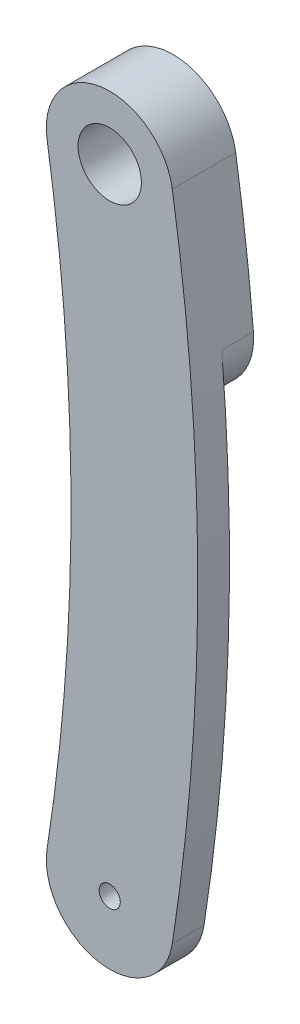
ISO-10303-21;
HEADER;
FILE_DESCRIPTION(('STEP AP214'),'2;1');
FILE_NAME('part.step','',(''),(''),'','','');
FILE_SCHEMA(('AUTOMOTIVE_DESIGN { 1 0 10303 214 1 1 1 1 }'));
ENDSEC;
DATA;
#1=APPLICATION_CONTEXT('core data for automotive mechanical design processes');
#2=APPLICATION_PROTOCOL_DEFINITION('international standard','automotive_design',2000,#1);
#3=PRODUCT_CONTEXT('',#1,'mechanical');
#4=PRODUCT('Part','Part','',(#3));
#5=PRODUCT_RELATED_PRODUCT_CATEGORY('part','',(#4));
#6=PRODUCT_DEFINITION_FORMATION('','',#4);
#7=PRODUCT_DEFINITION_CONTEXT('part definition',#1,'design');
#8=PRODUCT_DEFINITION('design','',#6,#7);
#9=PRODUCT_DEFINITION_SHAPE('','',#8);
#10=(LENGTH_UNIT() NAMED_UNIT(*) SI_UNIT(.MILLI.,.METRE.));
#11=(NAMED_UNIT(*) PLANE_ANGLE_UNIT() SI_UNIT($,.RADIAN.));
#12=(NAMED_UNIT(*) SI_UNIT($,.STERADIAN.) SOLID_ANGLE_UNIT());
#13=UNCERTAINTY_MEASURE_WITH_UNIT(LENGTH_MEASURE(1.E-05),#10,'distance_accuracy_value','');
#14=(GEOMETRIC_REPRESENTATION_CONTEXT(3) GLOBAL_UNCERTAINTY_ASSIGNED_CONTEXT((#13)) GLOBAL_UNIT_ASSIGNED_CONTEXT((#10,
#11,#12)) REPRESENTATION_CONTEXT('',''));
#15=CARTESIAN_POINT('',(0.,0.,0.));
#16=DIRECTION('',(0.,0.,1.));
#17=DIRECTION('',(1.,0.,0.));
#18=AXIS2_PLACEMENT_3D('',#15,#16,#17);
#19=CARTESIAN_POINT('',(-47.9165942028438,7.49999999999998,1.5));
#20=DIRECTION('',(0.,0.,1.));
#21=DIRECTION('',(1.,0.,0.));
#22=AXIS2_PLACEMENT_3D('',#19,#20,#21);
#23=PLANE('',#22);
#24=CARTESIAN_POINT('',(0.,-15.,1.5));
#25=DIRECTION('',(0.,0.,1.));
#26=DIRECTION('',(1.,0.,0.));
#27=AXIS2_PLACEMENT_3D('',#24,#25,#26);
#28=CIRCLE('',#27,0.5);
#29=CARTESIAN_POINT('',(0.499999999999998,-15.,1.5));
#30=VERTEX_POINT('',#29);
#31=EDGE_CURVE('E141',#30,#30,#28,.T.);
#32=ORIENTED_EDGE('',*,*,#31,.F.);
#33=EDGE_LOOP('',(#32));
#34=FACE_BOUND('',#33,.T.);
#35=CARTESIAN_POINT('',(0.,15.,1.5));
#36=DIRECTION('',(0.,0.,1.));
#37=DIRECTION('',(1.,0.,0.));
#38=AXIS2_PLACEMENT_3D('',#35,#36,#37);
#39=CIRCLE('',#38,3.);
#40=CARTESIAN_POINT('',(2.96391304347486,15.4639175257732,1.5));
#41=VERTEX_POINT('',#40);
#42=CARTESIAN_POINT('',(-2.96391304347488,14.5360824742268,1.5));
#43=VERTEX_POINT('',#42);
#44=EDGE_CURVE('E149',#41,#43,#39,.T.);
#45=ORIENTED_EDGE('',*,*,#44,.T.);
#46=CARTESIAN_POINT('',(-95.8331884056875,0.,1.5));
#47=DIRECTION('',(0.,0.,-1.));
#48=DIRECTION('',(-1.,0.,0.));
#49=AXIS2_PLACEMENT_3D('',#46,#47,#48);
#50=CIRCLE('',#49,94.);
#51=CARTESIAN_POINT('',(-2.96391304347489,-14.5360824742269,1.5));
#52=VERTEX_POINT('',#51);
#53=EDGE_CURVE('E87',#43,#52,#50,.T.);
#54=ORIENTED_EDGE('',*,*,#53,.T.);
#55=CARTESIAN_POINT('',(0.,-15.,1.5));
#56=DIRECTION('',(0.,0.,1.));
#57=DIRECTION('',(-1.,0.,0.));
#58=AXIS2_PLACEMENT_3D('',#55,#56,#57);
#59=CIRCLE('',#58,3.);
#60=CARTESIAN_POINT('',(2.96391304347488,-15.4639175257732,1.5));
#61=VERTEX_POINT('',#60);
#62=EDGE_CURVE('E154',#52,#61,#59,.T.);
#63=ORIENTED_EDGE('',*,*,#62,.T.);
#64=CARTESIAN_POINT('',(-95.8331884056875,0.,1.5));
#65=DIRECTION('',(0.,0.,1.));
#66=DIRECTION('',(-1.,0.,0.));
#67=AXIS2_PLACEMENT_3D('',#64,#65,#66);
#68=CIRCLE('',#67,100.);
#69=EDGE_CURVE('E64',#61,#41,#68,.T.);
#70=ORIENTED_EDGE('',*,*,#69,.T.);
#71=EDGE_LOOP('',(#45,#54,#63,#70));
#72=FACE_BOUND('',#71,.T.);
#73=CARTESIAN_POINT('',(0.,15.,1.5));
#74=DIRECTION('',(0.,0.,1.));
#75=DIRECTION('',(1.,0.,0.));
#76=AXIS2_PLACEMENT_3D('',#73,#74,#75);
#77=CIRCLE('',#76,1.5);
#78=CARTESIAN_POINT('',(1.5,15.,1.5));
#79=VERTEX_POINT('',#78);
#80=EDGE_CURVE('E129',#79,#79,#77,.T.);
#81=ORIENTED_EDGE('',*,*,#80,.F.);
#82=EDGE_LOOP('',(#81));
#83=FACE_BOUND('',#82,.T.);
#84=ADVANCED_FACE('F39',(#34,#72,#83),#23,.T.);
#85=CARTESIAN_POINT('',(-47.9165942028438,7.49999999999998,0.));
#86=DIRECTION('',(0.,0.,1.));
#87=DIRECTION('',(1.,0.,0.));
#88=AXIS2_PLACEMENT_3D('',#85,#86,#87);
#89=PLANE('',#88);
#90=CARTESIAN_POINT('',(0.812771675425031,8.28000000000003,0.));
#91=DIRECTION('',(0.,0.,-1.));
#92=DIRECTION('',(-1.,0.,0.));
#93=AXIS2_PLACEMENT_3D('',#90,#91,#92);
#94=CIRCLE('',#93,3.);
#95=CARTESIAN_POINT('',(3.80182198721202,8.53608247422683,0.));
#96=VERTEX_POINT('',#95);
#97=CARTESIAN_POINT('',(-2.17627863636196,8.02391752577322,0.));
#98=VERTEX_POINT('',#97);
#99=EDGE_CURVE('E55',#96,#98,#94,.T.);
#100=ORIENTED_EDGE('',*,*,#99,.F.);
#101=CARTESIAN_POINT('',(-95.8331884056875,0.,0.));
#102=DIRECTION('',(0.,0.,1.));
#103=DIRECTION('',(-1.,0.,0.));
#104=AXIS2_PLACEMENT_3D('',#101,#102,#103);
#105=CIRCLE('',#104,100.);
#106=CARTESIAN_POINT('',(2.96391304347488,-15.4639175257732,0.));
#107=VERTEX_POINT('',#106);
#108=EDGE_CURVE('E127',#107,#96,#105,.T.);
#109=ORIENTED_EDGE('',*,*,#108,.F.);
#110=CARTESIAN_POINT('',(0.,-15.,0.));
#111=DIRECTION('',(0.,0.,1.));
#112=DIRECTION('',(-1.,0.,0.));
#113=AXIS2_PLACEMENT_3D('',#110,#111,#112);
#114=CIRCLE('',#113,3.);
#115=CARTESIAN_POINT('',(-2.96391304347489,-14.5360824742269,0.));
#116=VERTEX_POINT('',#115);
#117=EDGE_CURVE('E80',#116,#107,#114,.T.);
#118=ORIENTED_EDGE('',*,*,#117,.F.);
#119=CARTESIAN_POINT('',(-95.8331884056875,0.,0.));
#120=DIRECTION('',(0.,0.,-1.));
#121=DIRECTION('',(-1.,0.,0.));
#122=AXIS2_PLACEMENT_3D('',#119,#120,#121);
#123=CIRCLE('',#122,94.);
#124=EDGE_CURVE('E145',#98,#116,#123,.T.);
#125=ORIENTED_EDGE('',*,*,#124,.F.);
#126=EDGE_LOOP('',(#100,#109,#118,#125));
#127=FACE_BOUND('',#126,.T.);
#128=CARTESIAN_POINT('',(0.,-15.,0.));
#129=DIRECTION('',(0.,0.,1.));
#130=DIRECTION('',(1.,0.,0.));
#131=AXIS2_PLACEMENT_3D('',#128,#129,#130);
#132=CIRCLE('',#131,0.5);
#133=CARTESIAN_POINT('',(0.499999999999998,-15.,0.));
#134=VERTEX_POINT('',#133);
#135=EDGE_CURVE('E135',#134,#134,#132,.T.);
#136=ORIENTED_EDGE('',*,*,#135,.T.);
#137=EDGE_LOOP('',(#136));
#138=FACE_BOUND('',#137,.T.);
#139=ADVANCED_FACE('F172',(#127,#138),#89,.F.);
#140=CARTESIAN_POINT('',(0.,15.,1.5));
#141=DIRECTION('',(0.,0.,-1.));
#142=DIRECTION('',(-1.,0.,0.));
#143=AXIS2_PLACEMENT_3D('',#140,#141,#142);
#144=CYLINDRICAL_SURFACE('',#143,3.);
#145=DIRECTION('',(0.,0.,-1.));
#146=VECTOR('',#145,1.);
#147=CARTESIAN_POINT('',(2.96391304347486,15.4639175257732,1.5));
#148=LINE('',#147,#146);
#149=CARTESIAN_POINT('',(2.96391304347486,15.4639175257732,-1.5));
#150=VERTEX_POINT('',#149);
#151=EDGE_CURVE('E159',#41,#150,#148,.T.);
#152=ORIENTED_EDGE('',*,*,#151,.T.);
#153=CARTESIAN_POINT('',(0.,15.,-1.5));
#154=DIRECTION('',(0.,0.,-1.));
#155=DIRECTION('',(-1.,0.,0.));
#156=AXIS2_PLACEMENT_3D('',#153,#154,#155);
#157=CIRCLE('',#156,3.);
#158=CARTESIAN_POINT('',(-2.96391304347488,14.5360824742267,-1.5));
#159=VERTEX_POINT('',#158);
#160=EDGE_CURVE('E121',#159,#150,#157,.T.);
#161=ORIENTED_EDGE('',*,*,#160,.F.);
#162=DIRECTION('',(0.,0.,-1.));
#163=VECTOR('',#162,1.);
#164=CARTESIAN_POINT('',(-2.96391304347488,14.5360824742268,1.5));
#165=LINE('',#164,#163);
#166=EDGE_CURVE('E11',#43,#159,#165,.T.);
#167=ORIENTED_EDGE('',*,*,#166,.F.);
#168=ORIENTED_EDGE('',*,*,#44,.F.);
#169=EDGE_LOOP('',(#152,#161,#167,#168));
#170=FACE_BOUND('',#169,.T.);
#171=ADVANCED_FACE('F41',(#170),#144,.T.);
#172=CARTESIAN_POINT('',(-95.8331884056875,0.,1.5));
#173=DIRECTION('',(0.,0.,-1.));
#174=DIRECTION('',(-1.,0.,0.));
#175=AXIS2_PLACEMENT_3D('',#172,#173,#174);
#176=CYLINDRICAL_SURFACE('',#175,94.);
#177=ORIENTED_EDGE('',*,*,#166,.T.);
#178=CARTESIAN_POINT('',(-95.8331884056875,0.,-1.5));
#179=DIRECTION('',(0.,0.,-1.));
#180=DIRECTION('',(-1.,0.,0.));
#181=AXIS2_PLACEMENT_3D('',#178,#179,#180);
#182=CIRCLE('',#181,94.);
#183=CARTESIAN_POINT('',(-2.17627863636196,8.02391752577322,-1.5));
#184=VERTEX_POINT('',#183);
#185=EDGE_CURVE('E114',#184,#159,#182,.F.);
#186=ORIENTED_EDGE('',*,*,#185,.F.);
#187=DIRECTION('',(0.,0.,1.));
#188=VECTOR('',#187,1.);
#189=CARTESIAN_POINT('',(-2.17627863636196,8.02391752577322,-1.5));
#190=LINE('',#189,#188);
#191=EDGE_CURVE('E109',#184,#98,#190,.T.);
#192=ORIENTED_EDGE('',*,*,#191,.T.);
#193=ORIENTED_EDGE('',*,*,#124,.T.);
#194=DIRECTION('',(0.,0.,-1.));
#195=VECTOR('',#194,1.);
#196=CARTESIAN_POINT('',(-2.96391304347489,-14.5360824742269,1.5));
#197=LINE('',#196,#195);
#198=EDGE_CURVE('E48',#52,#116,#197,.T.);
#199=ORIENTED_EDGE('',*,*,#198,.F.);
#200=ORIENTED_EDGE('',*,*,#53,.F.);
#201=EDGE_LOOP('',(#177,#186,#192,#193,#199,#200));
#202=FACE_BOUND('',#201,.T.);
#203=ADVANCED_FACE('F175',(#202),#176,.F.);
#204=CARTESIAN_POINT('',(0.,-15.,1.5));
#205=DIRECTION('',(0.,0.,-1.));
#206=DIRECTION('',(-1.,0.,0.));
#207=AXIS2_PLACEMENT_3D('',#204,#205,#206);
#208=CYLINDRICAL_SURFACE('',#207,3.);
#209=ORIENTED_EDGE('',*,*,#117,.T.);
#210=DIRECTION('',(0.,0.,-1.));
#211=VECTOR('',#210,1.);
#212=CARTESIAN_POINT('',(2.96391304347488,-15.4639175257732,1.5));
#213=LINE('',#212,#211);
#214=EDGE_CURVE('E167',#61,#107,#213,.T.);
#215=ORIENTED_EDGE('',*,*,#214,.F.);
#216=ORIENTED_EDGE('',*,*,#62,.F.);
#217=ORIENTED_EDGE('',*,*,#198,.T.);
#218=EDGE_LOOP('',(#209,#215,#216,#217));
#219=FACE_BOUND('',#218,.T.);
#220=ADVANCED_FACE('F171',(#219),#208,.T.);
#221=CARTESIAN_POINT('',(-95.8331884056875,0.,1.5));
#222=DIRECTION('',(0.,0.,-1.));
#223=DIRECTION('',(-1.,0.,0.));
#224=AXIS2_PLACEMENT_3D('',#221,#222,#223);
#225=CYLINDRICAL_SURFACE('',#224,100.);
#226=ORIENTED_EDGE('',*,*,#108,.T.);
#227=DIRECTION('',(0.,0.,1.));
#228=VECTOR('',#227,1.);
#229=CARTESIAN_POINT('',(3.80182198721202,8.53608247422683,-1.5));
#230=LINE('',#229,#228);
#231=CARTESIAN_POINT('',(3.80182198721202,8.53608247422683,-1.5));
#232=VERTEX_POINT('',#231);
#233=EDGE_CURVE('E107',#232,#96,#230,.T.);
#234=ORIENTED_EDGE('',*,*,#233,.F.);
#235=CARTESIAN_POINT('',(-95.8331884056875,0.,-1.5));
#236=DIRECTION('',(0.,0.,-1.));
#237=DIRECTION('',(-1.,0.,0.));
#238=AXIS2_PLACEMENT_3D('',#235,#236,#237);
#239=CIRCLE('',#238,100.);
#240=EDGE_CURVE('E115',#150,#232,#239,.T.);
#241=ORIENTED_EDGE('',*,*,#240,.F.);
#242=ORIENTED_EDGE('',*,*,#151,.F.);
#243=ORIENTED_EDGE('',*,*,#69,.F.);
#244=ORIENTED_EDGE('',*,*,#214,.T.);
#245=EDGE_LOOP('',(#226,#234,#241,#242,#243,#244));
#246=FACE_BOUND('',#245,.T.);
#247=ADVANCED_FACE('F126',(#246),#225,.T.);
#248=CARTESIAN_POINT('',(0.,-15.,1.5));
#249=DIRECTION('',(0.,0.,-1.));
#250=DIRECTION('',(-1.,0.,0.));
#251=AXIS2_PLACEMENT_3D('',#248,#249,#250);
#252=CYLINDRICAL_SURFACE('',#251,0.5);
#253=ORIENTED_EDGE('',*,*,#31,.T.);
#254=EDGE_LOOP('',(#253));
#255=FACE_BOUND('',#254,.T.);
#256=ORIENTED_EDGE('',*,*,#135,.F.);
#257=EDGE_LOOP('',(#256));
#258=FACE_BOUND('',#257,.T.);
#259=ADVANCED_FACE('F188',(#255,#258),#252,.F.);
#260=CARTESIAN_POINT('',(0.,15.,1.5));
#261=DIRECTION('',(0.,0.,-1.));
#262=DIRECTION('',(-1.,0.,0.));
#263=AXIS2_PLACEMENT_3D('',#260,#261,#262);
#264=CYLINDRICAL_SURFACE('',#263,1.5);
#265=ORIENTED_EDGE('',*,*,#80,.T.);
#266=EDGE_LOOP('',(#265));
#267=FACE_BOUND('',#266,.T.);
#268=CARTESIAN_POINT('',(0.,15.,-1.5));
#269=DIRECTION('',(0.,0.,-1.));
#270=DIRECTION('',(-1.,0.,0.));
#271=AXIS2_PLACEMENT_3D('',#268,#269,#270);
#272=CIRCLE('',#271,1.5);
#273=CARTESIAN_POINT('',(-1.5,15.,-1.5));
#274=VERTEX_POINT('',#273);
#275=EDGE_CURVE('E124',#274,#274,#272,.F.);
#276=ORIENTED_EDGE('',*,*,#275,.F.);
#277=EDGE_LOOP('',(#276));
#278=FACE_BOUND('',#277,.T.);
#279=ADVANCED_FACE('F186',(#267,#278),#264,.F.);
#280=CARTESIAN_POINT('',(0.812771675425031,8.28000000000003,-1.5));
#281=DIRECTION('',(0.,0.,1.));
#282=DIRECTION('',(1.,0.,0.));
#283=AXIS2_PLACEMENT_3D('',#280,#281,#282);
#284=CYLINDRICAL_SURFACE('',#283,3.);
#285=ORIENTED_EDGE('',*,*,#99,.T.);
#286=ORIENTED_EDGE('',*,*,#191,.F.);
#287=CARTESIAN_POINT('',(0.812771675425031,8.28000000000003,-1.5));
#288=DIRECTION('',(0.,0.,-1.));
#289=DIRECTION('',(-1.,0.,0.));
#290=AXIS2_PLACEMENT_3D('',#287,#288,#289);
#291=CIRCLE('',#290,3.);
#292=EDGE_CURVE('E103',#232,#184,#291,.T.);
#293=ORIENTED_EDGE('',*,*,#292,.F.);
#294=ORIENTED_EDGE('',*,*,#233,.T.);
#295=EDGE_LOOP('',(#285,#286,#293,#294));
#296=FACE_BOUND('',#295,.T.);
#297=ADVANCED_FACE('F105',(#296),#284,.T.);
#298=CARTESIAN_POINT('',(0.,0.,-1.5));
#299=DIRECTION('',(0.,0.,-1.));
#300=DIRECTION('',(-1.,0.,0.));
#301=AXIS2_PLACEMENT_3D('',#298,#299,#300);
#302=PLANE('',#301);
#303=ORIENTED_EDGE('',*,*,#275,.T.);
#304=EDGE_LOOP('',(#303));
#305=FACE_BOUND('',#304,.T.);
#306=ORIENTED_EDGE('',*,*,#240,.T.);
#307=ORIENTED_EDGE('',*,*,#292,.T.);
#308=ORIENTED_EDGE('',*,*,#185,.T.);
#309=ORIENTED_EDGE('',*,*,#160,.T.);
#310=EDGE_LOOP('',(#306,#307,#308,#309));
#311=FACE_BOUND('',#310,.T.);
#312=ADVANCED_FACE('F119',(#305,#311),#302,.T.);
#313=CLOSED_SHELL('',(#84,#139,#171,#203,#220,#247,#259,#279,#297,#312));
#314=MANIFOLD_SOLID_BREP('B2',#313);
#315=ADVANCED_BREP_SHAPE_REPRESENTATION('',(#18,#314),#14);
#316=SHAPE_DEFINITION_REPRESENTATION(#9,#315);
ENDSEC;
END-ISO-10303-21;
